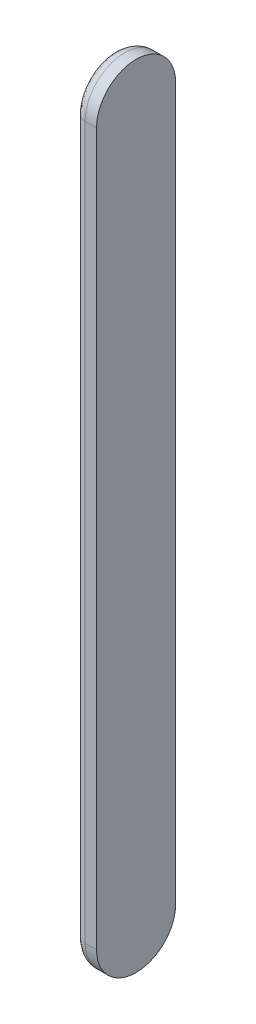
ISO-10303-21;
HEADER;
FILE_DESCRIPTION(('STEP AP214'),'2;1');
FILE_NAME('part.step','',(''),(''),'','','');
FILE_SCHEMA(('AUTOMOTIVE_DESIGN { 1 0 10303 214 1 1 1 1 }'));
ENDSEC;
DATA;
#1=APPLICATION_CONTEXT('core data for automotive mechanical design processes');
#2=APPLICATION_PROTOCOL_DEFINITION('international standard','automotive_design',2000,#1);
#3=PRODUCT_CONTEXT('',#1,'mechanical');
#4=PRODUCT('Part','Part','',(#3));
#5=PRODUCT_RELATED_PRODUCT_CATEGORY('part','',(#4));
#6=PRODUCT_DEFINITION_FORMATION('','',#4);
#7=PRODUCT_DEFINITION_CONTEXT('part definition',#1,'design');
#8=PRODUCT_DEFINITION('design','',#6,#7);
#9=PRODUCT_DEFINITION_SHAPE('','',#8);
#10=(LENGTH_UNIT() NAMED_UNIT(*) SI_UNIT(.MILLI.,.METRE.));
#11=(NAMED_UNIT(*) PLANE_ANGLE_UNIT() SI_UNIT($,.RADIAN.));
#12=(NAMED_UNIT(*) SI_UNIT($,.STERADIAN.) SOLID_ANGLE_UNIT());
#13=UNCERTAINTY_MEASURE_WITH_UNIT(LENGTH_MEASURE(1.E-05),#10,'distance_accuracy_value','');
#14=(GEOMETRIC_REPRESENTATION_CONTEXT(3) GLOBAL_UNCERTAINTY_ASSIGNED_CONTEXT((#13)) GLOBAL_UNIT_ASSIGNED_CONTEXT((#10,
#11,#12)) REPRESENTATION_CONTEXT('',''));
#15=CARTESIAN_POINT('',(0.,0.,0.));
#16=DIRECTION('',(0.,0.,1.));
#17=DIRECTION('',(1.,0.,0.));
#18=AXIS2_PLACEMENT_3D('',#15,#16,#17);
#19=CARTESIAN_POINT('',(-31.778294457,15.6743914096,-106.3645490688));
#20=CARTESIAN_POINT('',(-31.778294457,14.4767761518,-106.3645490688));
#21=CARTESIAN_POINT('',(-31.778294457,14.4767761518,-105.166933811));
#22=CARTESIAN_POINT('',(-31.778294457,15.6743914096,-105.166933811));
#23=CARTESIAN_POINT('',(-31.7956213972,15.6743914096,-106.5372404176));
#24=CARTESIAN_POINT('',(-31.7956213972,14.1313934542,-106.5372404176));
#25=CARTESIAN_POINT('',(-31.7956213972,14.1313934542,-104.9942424622));
#26=CARTESIAN_POINT('',(-31.7956213972,15.6743914096,-104.9942424622));
#27=CARTESIAN_POINT('',(-31.6728970554,15.6743914096,-106.6599647594));
#28=CARTESIAN_POINT('',(-31.6728970554,13.885944796,-106.6599647594));
#29=CARTESIAN_POINT('',(-31.6728970554,13.885944796,-104.8715181458));
#30=CARTESIAN_POINT('',(-31.6728970554,15.6743914096,-104.8715181458));
#31=CARTESIAN_POINT('',(-31.500205732,15.6743914096,-106.6426378192));
#32=CARTESIAN_POINT('',(-31.500205732,13.920598651,-106.6426378192));
#33=CARTESIAN_POINT('',(-31.500205732,13.920598651,-104.8888450606));
#34=CARTESIAN_POINT('',(-31.500205732,15.6743914096,-104.8888450606));
#35=(BOUNDED_SURFACE() B_SPLINE_SURFACE(3,3,((#19,#20,#21,#22),(#23,#24,#25,#26),(#27,#28,#29,
#30),(#31,#32,#33,#34)),.UNSPECIFIED.,.F.,.F.,.F.) B_SPLINE_SURFACE_WITH_KNOTS((4,4),(4,4),(0.,
1.),(0.,1.),.UNSPECIFIED.) GEOMETRIC_REPRESENTATION_ITEM() RATIONAL_B_SPLINE_SURFACE(((1.,
0.333333333333333,0.333333333333333,1.),(0.755320871117987,0.251773623705996,0.251773623705996,
0.755320871117987),(0.755320871117987,0.251773623705996,0.251773623705996,0.755320871117987),
(1.,0.333333333333333,0.333333333333333,1.))) REPRESENTATION_ITEM('') SURFACE());
#36=CARTESIAN_POINT('',(-31.5255634156,15.6743914096,-105.1415761274));
#37=DIRECTION('',(0.,-1.,0.));
#38=DIRECTION('',(0.,0.,-1.));
#39=AXIS2_PLACEMENT_3D('',#36,#37,#38);
#40=CIRCLE('',#39,0.25399999999999);
#41=CARTESIAN_POINT('',(-31.525563415626,15.6743914095099,-104.88757613375));
#42=VERTEX_POINT('',#41);
#43=CARTESIAN_POINT('',(-31.779563411811,15.6743914091926,-105.14157612616));
#44=VERTEX_POINT('',#43);
#45=EDGE_CURVE('E59',#42,#44,#40,.T.);
#46=CARTESIAN_POINT('',(-31.7795634004439,15.6743914096,-105.141576122537));
#47=CARTESIAN_POINT('',(-31.7795634004439,14.4260607746486,-105.141576122537));
#48=CARTESIAN_POINT('',(-31.7795634004439,14.4260607746486,-106.389906757488));
#49=CARTESIAN_POINT('',(-31.7795634004439,15.6743914096,-106.389906757488));
#50=(BOUNDED_CURVE() B_SPLINE_CURVE(3,(#46,#47,#48,#49),.UNSPECIFIED.,.F.,
.F.) B_SPLINE_CURVE_WITH_KNOTS((4,4),(0.,1.),
.UNSPECIFIED.) CURVE() GEOMETRIC_REPRESENTATION_ITEM() RATIONAL_B_SPLINE_CURVE((0.956578302165982,
0.318859434055327,0.318859434055327,0.956578302165982)) REPRESENTATION_ITEM(''));
#51=CARTESIAN_POINT('',(-31.779563411811,15.6743914091926,-106.389906753696));
#52=VERTEX_POINT('',#51);
#53=EDGE_CURVE('E92',#52,#44,#50,.F.);
#54=CARTESIAN_POINT('',(-31.5255634156,15.6743914096,-106.3899067524));
#55=DIRECTION('',(0.,1.,0.));
#56=DIRECTION('',(0.,0.,1.));
#57=AXIS2_PLACEMENT_3D('',#54,#55,#56);
#58=CIRCLE('',#57,0.25399999999999);
#59=CARTESIAN_POINT('',(-31.525563415626,15.6743914095211,-106.6439067524));
#60=VERTEX_POINT('',#59);
#61=EDGE_CURVE('E86',#52,#60,#58,.F.);
#62=CARTESIAN_POINT('',(-31.5255634156,15.6743914096,-105.7657414526));
#63=DIRECTION('',(1.,0.,0.));
#64=DIRECTION('',(0.,0.,-1.));
#65=AXIS2_PLACEMENT_3D('',#62,#63,#64);
#66=CIRCLE('',#65,0.878165299800032);
#67=EDGE_CURVE('E89',#60,#42,#66,.F.);
#68=ORIENTED_EDGE('',*,*,#45,.T.);
#69=ORIENTED_EDGE('',*,*,#53,.F.);
#70=ORIENTED_EDGE('',*,*,#61,.T.);
#71=ORIENTED_EDGE('',*,*,#67,.T.);
#72=EDGE_LOOP('',(#68,#69,#70,#71));
#73=FACE_BOUND('',#72,.T.);
#74=ADVANCED_FACE('F17',(#73),#35,.T.);
#75=CARTESIAN_POINT('',(-31.5255634156,31.4813671616,-105.1415761274));
#76=DIRECTION('',(0.,-1.,0.));
#77=DIRECTION('',(0.,0.,-1.));
#78=AXIS2_PLACEMENT_3D('',#75,#76,#77);
#79=CYLINDRICAL_SURFACE('',#78,0.25399999999999);
#80=DIRECTION('',(0.,1.,0.));
#81=VECTOR('',#80,1.);
#82=CARTESIAN_POINT('',(-31.5255634156,23.5778792856,-104.8875761274));
#83=LINE('',#82,#81);
#84=CARTESIAN_POINT('',(-31.525563415626,31.4813671616,-104.88757613375));
#85=VERTEX_POINT('',#84);
#86=EDGE_CURVE('E111',#42,#85,#83,.T.);
#87=ORIENTED_EDGE('',*,*,#86,.T.);
#88=CARTESIAN_POINT('',(-31.5255634156,31.4813671616,-105.1415761274));
#89=DIRECTION('',(0.,-1.,0.));
#90=DIRECTION('',(0.,0.,-1.));
#91=AXIS2_PLACEMENT_3D('',#88,#89,#90);
#92=CIRCLE('',#91,0.25399999999999);
#93=CARTESIAN_POINT('',(-31.779563411811,31.4813671620074,-105.141576125949));
#94=VERTEX_POINT('',#93);
#95=EDGE_CURVE('E72',#94,#85,#92,.F.);
#96=ORIENTED_EDGE('',*,*,#95,.F.);
#97=DIRECTION('',(0.,1.,0.));
#98=VECTOR('',#97,1.);
#99=CARTESIAN_POINT('',(-31.7795634156,23.5778792856,-105.1415761274));
#100=LINE('',#99,#98);
#101=EDGE_CURVE('E159',#44,#94,#100,.T.);
#102=ORIENTED_EDGE('',*,*,#101,.F.);
#103=ORIENTED_EDGE('',*,*,#45,.F.);
#104=EDGE_LOOP('',(#87,#96,#102,#103));
#105=FACE_BOUND('',#104,.T.);
#106=ADVANCED_FACE('F191',(#105),#79,.T.);
#107=CARTESIAN_POINT('',(-31.5255634156,15.6743914096,-106.3899067524));
#108=DIRECTION('',(0.,1.,0.));
#109=DIRECTION('',(0.,0.,1.));
#110=AXIS2_PLACEMENT_3D('',#107,#108,#109);
#111=CYLINDRICAL_SURFACE('',#110,0.25399999999999);
#112=DIRECTION('',(0.,-1.,0.));
#113=VECTOR('',#112,1.);
#114=CARTESIAN_POINT('',(-31.5255634156,23.5778792856,-106.6439067524));
#115=LINE('',#114,#113);
#116=CARTESIAN_POINT('',(-31.525563415626,31.4813671616,-106.6439067524));
#117=VERTEX_POINT('',#116);
#118=EDGE_CURVE('E98',#117,#60,#115,.T.);
#119=ORIENTED_EDGE('',*,*,#118,.T.);
#120=ORIENTED_EDGE('',*,*,#61,.F.);
#121=DIRECTION('',(0.,-1.,0.));
#122=VECTOR('',#121,1.);
#123=CARTESIAN_POINT('',(-31.7795634156,23.5778792856,-106.3899067524));
#124=LINE('',#123,#122);
#125=CARTESIAN_POINT('',(-31.779563411811,31.4813671620074,-106.389906753907));
#126=VERTEX_POINT('',#125);
#127=EDGE_CURVE('E157',#126,#52,#124,.T.);
#128=ORIENTED_EDGE('',*,*,#127,.F.);
#129=CARTESIAN_POINT('',(-31.5255634156,31.4813671616,-106.3899067524));
#130=DIRECTION('',(0.,1.,0.));
#131=DIRECTION('',(0.,0.,1.));
#132=AXIS2_PLACEMENT_3D('',#129,#130,#131);
#133=CIRCLE('',#132,0.25399999999999);
#134=EDGE_CURVE('E79',#117,#126,#133,.T.);
#135=ORIENTED_EDGE('',*,*,#134,.F.);
#136=EDGE_LOOP('',(#119,#120,#128,#135));
#137=FACE_BOUND('',#136,.T.);
#138=ADVANCED_FACE('F99',(#137),#111,.T.);
#139=CARTESIAN_POINT('',(-31.5255634156,15.6743914096,-106.6439067524));
#140=DIRECTION('',(0.,0.,1.));
#141=DIRECTION('',(1.,0.,0.));
#142=AXIS2_PLACEMENT_3D('',#139,#140,#141);
#143=PLANE('',#142);
#144=ORIENTED_EDGE('',*,*,#118,.F.);
#145=DIRECTION('',(-1.,0.,0.));
#146=VECTOR('',#145,1.);
#147=CARTESIAN_POINT('',(-31.3985634156,31.4813671616,-106.6439067524));
#148=LINE('',#147,#146);
#149=CARTESIAN_POINT('',(-31.2715634156,31.4813671616,-106.6439067524));
#150=VERTEX_POINT('',#149);
#151=EDGE_CURVE('E101',#150,#117,#148,.T.);
#152=ORIENTED_EDGE('',*,*,#151,.F.);
#153=DIRECTION('',(0.,-1.,0.));
#154=VECTOR('',#153,1.);
#155=CARTESIAN_POINT('',(-31.2715634156,23.5778792856,-106.6439067524));
#156=LINE('',#155,#154);
#157=CARTESIAN_POINT('',(-31.2715634156,15.6743914095211,-106.6439067524));
#158=VERTEX_POINT('',#157);
#159=EDGE_CURVE('E48',#150,#158,#156,.T.);
#160=ORIENTED_EDGE('',*,*,#159,.T.);
#161=DIRECTION('',(1.,0.,0.));
#162=VECTOR('',#161,1.);
#163=CARTESIAN_POINT('',(-31.3985634156,15.6743914094423,-106.6439067524));
#164=LINE('',#163,#162);
#165=EDGE_CURVE('E100',#158,#60,#164,.F.);
#166=ORIENTED_EDGE('',*,*,#165,.T.);
#167=EDGE_LOOP('',(#144,#152,#160,#166));
#168=FACE_BOUND('',#167,.T.);
#169=ADVANCED_FACE('F103',(#168),#143,.F.);
#170=CARTESIAN_POINT('',(-31.5255634156,15.6743914096,-105.7657414526));
#171=DIRECTION('',(1.,0.,0.));
#172=DIRECTION('',(0.,0.,-1.));
#173=AXIS2_PLACEMENT_3D('',#170,#171,#172);
#174=CYLINDRICAL_SURFACE('',#173,0.878165299800032);
#175=ORIENTED_EDGE('',*,*,#67,.F.);
#176=ORIENTED_EDGE('',*,*,#165,.F.);
#177=CARTESIAN_POINT('',(-31.2715634156,15.6743914096,-105.7657414526));
#178=DIRECTION('',(1.,0.,0.));
#179=DIRECTION('',(0.,0.,-1.));
#180=AXIS2_PLACEMENT_3D('',#177,#178,#179);
#181=CIRCLE('',#180,0.878165299800032);
#182=CARTESIAN_POINT('',(-31.2715634156,15.6743914096,-104.8875761274));
#183=VERTEX_POINT('',#182);
#184=EDGE_CURVE('E21',#158,#183,#181,.F.);
#185=ORIENTED_EDGE('',*,*,#184,.T.);
#186=DIRECTION('',(-1.,0.,0.));
#187=VECTOR('',#186,1.);
#188=CARTESIAN_POINT('',(-31.3985634156,15.6743914096,-104.8875761274));
#189=LINE('',#188,#187);
#190=EDGE_CURVE('E109',#183,#42,#189,.T.);
#191=ORIENTED_EDGE('',*,*,#190,.T.);
#192=EDGE_LOOP('',(#175,#176,#185,#191));
#193=FACE_BOUND('',#192,.T.);
#194=ADVANCED_FACE('F107',(#193),#174,.T.);
#195=CARTESIAN_POINT('',(-31.2715634156,15.6743914096,-104.8875761274));
#196=DIRECTION('',(0.,0.,-1.));
#197=DIRECTION('',(-1.,0.,0.));
#198=AXIS2_PLACEMENT_3D('',#195,#196,#197);
#199=PLANE('',#198);
#200=ORIENTED_EDGE('',*,*,#86,.F.);
#201=ORIENTED_EDGE('',*,*,#190,.F.);
#202=DIRECTION('',(0.,1.,0.));
#203=VECTOR('',#202,1.);
#204=CARTESIAN_POINT('',(-31.2715634156,23.5778792856,-104.8875761274));
#205=LINE('',#204,#203);
#206=CARTESIAN_POINT('',(-31.2715634156,31.4813671616,-104.8875761274));
#207=VERTEX_POINT('',#206);
#208=EDGE_CURVE('E151',#183,#207,#205,.T.);
#209=ORIENTED_EDGE('',*,*,#208,.T.);
#210=DIRECTION('',(1.,0.,0.));
#211=VECTOR('',#210,1.);
#212=CARTESIAN_POINT('',(-31.3985634156,31.4813671616,-104.8875761274));
#213=LINE('',#212,#211);
#214=EDGE_CURVE('E36',#85,#207,#213,.T.);
#215=ORIENTED_EDGE('',*,*,#214,.F.);
#216=EDGE_LOOP('',(#200,#201,#209,#215));
#217=FACE_BOUND('',#216,.T.);
#218=ADVANCED_FACE('F138',(#217),#199,.F.);
#219=CARTESIAN_POINT('',(-31.7795634156,14.9478942596,-106.3899067524));
#220=DIRECTION('',(-1.,0.,0.));
#221=DIRECTION('',(0.,0.,1.));
#222=AXIS2_PLACEMENT_3D('',#219,#220,#221);
#223=PLANE('',#222);
#224=CARTESIAN_POINT('',(-31.7795634004439,31.4813671616,-106.389906758329));
#225=CARTESIAN_POINT('',(-31.7795634004439,32.7296977948924,-106.389906758329));
#226=CARTESIAN_POINT('',(-31.7795634004439,32.7296977948924,-105.141576121696));
#227=CARTESIAN_POINT('',(-31.7795634004439,31.4813671616,-105.141576121696));
#228=(BOUNDED_CURVE() B_SPLINE_CURVE(3,(#224,#225,#226,#227),.UNSPECIFIED.,.F.,
.F.) B_SPLINE_CURVE_WITH_KNOTS((4,4),(0.,1.),
.UNSPECIFIED.) CURVE() GEOMETRIC_REPRESENTATION_ITEM() RATIONAL_B_SPLINE_CURVE((0.956578300853994,
0.318859433617998,0.318859433617998,0.956578300853994)) REPRESENTATION_ITEM(''));
#229=EDGE_CURVE('E124',#126,#94,#228,.T.);
#230=ORIENTED_EDGE('',*,*,#229,.F.);
#231=ORIENTED_EDGE('',*,*,#127,.T.);
#232=ORIENTED_EDGE('',*,*,#53,.T.);
#233=ORIENTED_EDGE('',*,*,#101,.T.);
#234=EDGE_LOOP('',(#230,#231,#232,#233));
#235=FACE_BOUND('',#234,.T.);
#236=ADVANCED_FACE('F129',(#235),#223,.T.);
#237=CARTESIAN_POINT('',(-31.2715634156,14.6908462596,-106.6439067524));
#238=DIRECTION('',(-1.,0.,0.));
#239=DIRECTION('',(0.,0.,1.));
#240=AXIS2_PLACEMENT_3D('',#237,#238,#239);
#241=PLANE('',#240);
#242=ORIENTED_EDGE('',*,*,#208,.F.);
#243=ORIENTED_EDGE('',*,*,#184,.F.);
#244=ORIENTED_EDGE('',*,*,#159,.F.);
#245=CARTESIAN_POINT('',(-31.2715634156,31.4813671616,-105.7657414526));
#246=DIRECTION('',(1.,0.,0.));
#247=DIRECTION('',(0.,0.,-1.));
#248=AXIS2_PLACEMENT_3D('',#245,#246,#247);
#249=CIRCLE('',#248,0.878165299800032);
#250=EDGE_CURVE('E27',#150,#207,#249,.T.);
#251=ORIENTED_EDGE('',*,*,#250,.T.);
#252=EDGE_LOOP('',(#242,#243,#244,#251));
#253=FACE_BOUND('',#252,.T.);
#254=ADVANCED_FACE('F19',(#253),#241,.F.);
#255=CARTESIAN_POINT('',(-31.778294457,31.4813671616,-105.166933811));
#256=CARTESIAN_POINT('',(-31.778294457,32.6789824194,-105.166933811));
#257=CARTESIAN_POINT('',(-31.778294457,32.6789824194,-106.3645490688));
#258=CARTESIAN_POINT('',(-31.778294457,31.4813671616,-106.3645490688));
#259=CARTESIAN_POINT('',(-31.7956213972,31.4813671616,-104.9942424622));
#260=CARTESIAN_POINT('',(-31.7956213972,33.0243650916,-104.9942424622));
#261=CARTESIAN_POINT('',(-31.7956213972,33.0243650916,-106.5372404176));
#262=CARTESIAN_POINT('',(-31.7956213972,31.4813671616,-106.5372404176));
#263=CARTESIAN_POINT('',(-31.6728970554,31.4813671616,-104.8715181458));
#264=CARTESIAN_POINT('',(-31.6728970554,33.2698137752,-104.8715181458));
#265=CARTESIAN_POINT('',(-31.6728970554,33.2698137752,-106.6599647594));
#266=CARTESIAN_POINT('',(-31.6728970554,31.4813671616,-106.6599647594));
#267=CARTESIAN_POINT('',(-31.500205732,31.4813671616,-104.8888450606));
#268=CARTESIAN_POINT('',(-31.500205732,33.2351598948,-104.8888450606));
#269=CARTESIAN_POINT('',(-31.500205732,33.2351598948,-106.6426378192));
#270=CARTESIAN_POINT('',(-31.500205732,31.4813671616,-106.6426378192));
#271=(BOUNDED_SURFACE() B_SPLINE_SURFACE(3,3,((#255,#256,#257,#258),(#259,#260,#261,#262),(#263,
#264,#265,#266),(#267,#268,#269,#270)),.UNSPECIFIED.,.F.,.F.,
.F.) B_SPLINE_SURFACE_WITH_KNOTS((4,4),(4,4),(0.,1.),(0.,1.),
.UNSPECIFIED.) GEOMETRIC_REPRESENTATION_ITEM() RATIONAL_B_SPLINE_SURFACE(((1.,0.333333333333333,
0.333333333333333,1.),(0.755320871117987,0.251773623705996,0.251773623705996,0.755320871117987),
(0.755320871117987,0.251773623705996,0.251773623705996,0.755320871117987),(1.,0.333333333333333,
0.333333333333333,1.))) REPRESENTATION_ITEM('') SURFACE());
#272=CARTESIAN_POINT('',(-31.5255634156,31.4813671616,-105.7657414526));
#273=DIRECTION('',(1.,0.,0.));
#274=DIRECTION('',(0.,0.,-1.));
#275=AXIS2_PLACEMENT_3D('',#272,#273,#274);
#276=CIRCLE('',#275,0.878165299800032);
#277=EDGE_CURVE('E11',#85,#117,#276,.F.);
#278=ORIENTED_EDGE('',*,*,#95,.T.);
#279=ORIENTED_EDGE('',*,*,#277,.T.);
#280=ORIENTED_EDGE('',*,*,#134,.T.);
#281=ORIENTED_EDGE('',*,*,#229,.T.);
#282=EDGE_LOOP('',(#278,#279,#280,#281));
#283=FACE_BOUND('',#282,.T.);
#284=ADVANCED_FACE('F169',(#283),#271,.T.);
#285=CARTESIAN_POINT('',(-31.5255634156,31.4813671616,-105.7657414526));
#286=DIRECTION('',(1.,0.,0.));
#287=DIRECTION('',(0.,0.,-1.));
#288=AXIS2_PLACEMENT_3D('',#285,#286,#287);
#289=CYLINDRICAL_SURFACE('',#288,0.878165299800032);
#290=ORIENTED_EDGE('',*,*,#277,.F.);
#291=ORIENTED_EDGE('',*,*,#214,.T.);
#292=ORIENTED_EDGE('',*,*,#250,.F.);
#293=ORIENTED_EDGE('',*,*,#151,.T.);
#294=EDGE_LOOP('',(#290,#291,#292,#293));
#295=FACE_BOUND('',#294,.T.);
#296=ADVANCED_FACE('F181',(#295),#289,.T.);
#297=CLOSED_SHELL('',(#74,#106,#138,#169,#194,#218,#236,#254,#284,#296));
#298=MANIFOLD_SOLID_BREP('B1',#297);
#299=ADVANCED_BREP_SHAPE_REPRESENTATION('',(#18,#298),#14);
#300=SHAPE_DEFINITION_REPRESENTATION(#9,#299);
ENDSEC;
END-ISO-10303-21;
